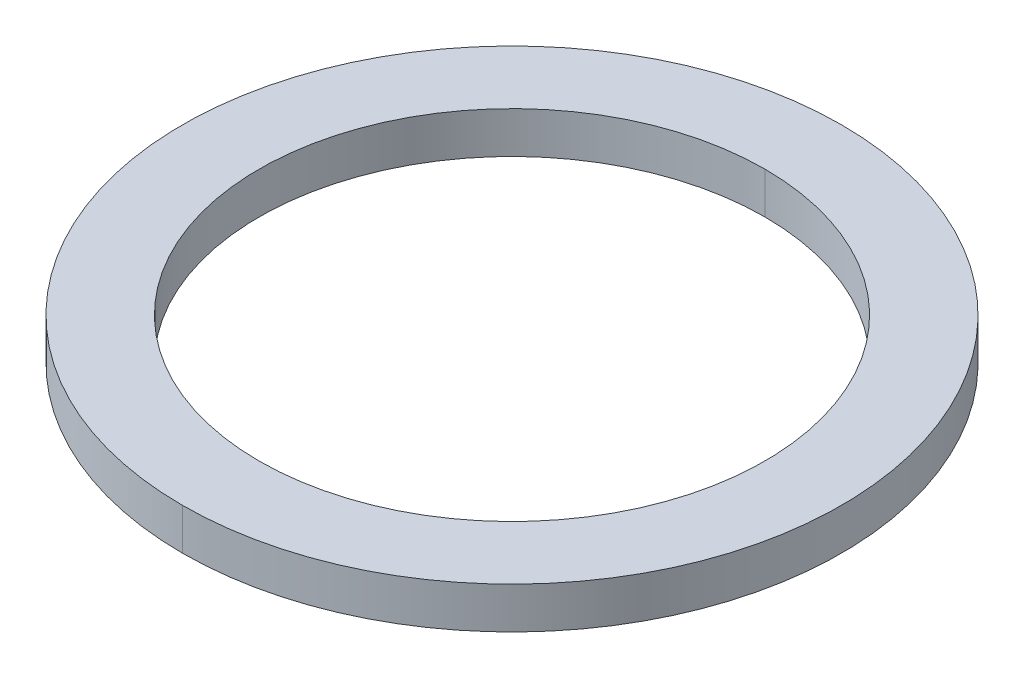
ISO-10303-21;
HEADER;
FILE_DESCRIPTION(('STEP AP214'),'2;1');
FILE_NAME('part.step','',(''),(''),'','','');
FILE_SCHEMA(('AUTOMOTIVE_DESIGN { 1 0 10303 214 1 1 1 1 }'));
ENDSEC;
DATA;
#1=APPLICATION_CONTEXT('core data for automotive mechanical design processes');
#2=APPLICATION_PROTOCOL_DEFINITION('international standard','automotive_design',2000,#1);
#3=PRODUCT_CONTEXT('',#1,'mechanical');
#4=PRODUCT('Part','Part','',(#3));
#5=PRODUCT_RELATED_PRODUCT_CATEGORY('part','',(#4));
#6=PRODUCT_DEFINITION_FORMATION('','',#4);
#7=PRODUCT_DEFINITION_CONTEXT('part definition',#1,'design');
#8=PRODUCT_DEFINITION('design','',#6,#7);
#9=PRODUCT_DEFINITION_SHAPE('','',#8);
#10=(LENGTH_UNIT() NAMED_UNIT(*) SI_UNIT(.MILLI.,.METRE.));
#11=(NAMED_UNIT(*) PLANE_ANGLE_UNIT() SI_UNIT($,.RADIAN.));
#12=(NAMED_UNIT(*) SI_UNIT($,.STERADIAN.) SOLID_ANGLE_UNIT());
#13=UNCERTAINTY_MEASURE_WITH_UNIT(LENGTH_MEASURE(1.E-05),#10,'distance_accuracy_value','');
#14=(GEOMETRIC_REPRESENTATION_CONTEXT(3) GLOBAL_UNCERTAINTY_ASSIGNED_CONTEXT((#13)) GLOBAL_UNIT_ASSIGNED_CONTEXT((#10,
#11,#12)) REPRESENTATION_CONTEXT('',''));
#15=CARTESIAN_POINT('',(0.,0.,0.));
#16=DIRECTION('',(0.,0.,1.));
#17=DIRECTION('',(1.,0.,0.));
#18=AXIS2_PLACEMENT_3D('',#15,#16,#17);
#19=CARTESIAN_POINT('',(-2.90698826646719,6.91171873202198,54.127124258992));
#20=DIRECTION('',(0.,-1.,0.));
#21=DIRECTION('',(0.,0.,1.));
#22=AXIS2_PLACEMENT_3D('',#19,#20,#21);
#23=CYLINDRICAL_SURFACE('',#22,7.95);
#24=DIRECTION('',(0.,-1.,0.));
#25=VECTOR('',#24,1.);
#26=CARTESIAN_POINT('',(-2.90698826646719,6.91171873202198,62.0771242589921));
#27=LINE('',#26,#25);
#28=CARTESIAN_POINT('',(-2.90698826646719,7.91171873202198,62.0771242589921));
#29=VERTEX_POINT('',#28);
#30=CARTESIAN_POINT('',(-2.90698826646719,6.91171873202198,62.0771242589921));
#31=VERTEX_POINT('',#30);
#32=EDGE_CURVE('E74',#29,#31,#27,.T.);
#33=ORIENTED_EDGE('',*,*,#32,.F.);
#34=CARTESIAN_POINT('',(-2.90698826646719,7.91171873202198,54.127124258992));
#35=DIRECTION('',(0.,-1.,0.));
#36=DIRECTION('',(0.,0.,-1.));
#37=AXIS2_PLACEMENT_3D('',#34,#35,#36);
#38=CIRCLE('',#37,7.95);
#39=CARTESIAN_POINT('',(-2.90698826646719,7.91171873202198,46.1771242589921));
#40=VERTEX_POINT('',#39);
#41=EDGE_CURVE('E69',#29,#40,#38,.T.);
#42=ORIENTED_EDGE('',*,*,#41,.T.);
#43=DIRECTION('',(0.,-1.,0.));
#44=VECTOR('',#43,1.);
#45=CARTESIAN_POINT('',(-2.90698826646719,6.91171873202198,46.1771242589921));
#46=LINE('',#45,#44);
#47=CARTESIAN_POINT('',(-2.90698826646719,6.91171873202198,46.1771242589921));
#48=VERTEX_POINT('',#47);
#49=EDGE_CURVE('E71',#40,#48,#46,.T.);
#50=ORIENTED_EDGE('',*,*,#49,.T.);
#51=CARTESIAN_POINT('',(-2.90698826646719,6.91171873202198,54.127124258992));
#52=DIRECTION('',(0.,-1.,0.));
#53=DIRECTION('',(0.,0.,-1.));
#54=AXIS2_PLACEMENT_3D('',#51,#52,#53);
#55=CIRCLE('',#54,7.95);
#56=EDGE_CURVE('E11',#31,#48,#55,.T.);
#57=ORIENTED_EDGE('',*,*,#56,.F.);
#58=EDGE_LOOP('',(#33,#42,#50,#57));
#59=FACE_BOUND('',#58,.T.);
#60=ADVANCED_FACE('F17',(#59),#23,.T.);
#61=CARTESIAN_POINT('',(-9.00698826646719,6.91171873202198,54.127124258992));
#62=DIRECTION('',(0.,1.,0.));
#63=DIRECTION('',(1.,0.,0.));
#64=AXIS2_PLACEMENT_3D('',#61,#62,#63);
#65=PLANE('',#64);
#66=CARTESIAN_POINT('',(-2.90698826646719,6.91171873202198,54.127124258992));
#67=DIRECTION('',(0.,-1.,0.));
#68=DIRECTION('',(0.,0.,-1.));
#69=AXIS2_PLACEMENT_3D('',#66,#67,#68);
#70=CIRCLE('',#69,6.1);
#71=CARTESIAN_POINT('',(-2.90698826646719,6.91171873202198,48.027124258992));
#72=VERTEX_POINT('',#71);
#73=CARTESIAN_POINT('',(-2.90698826646719,6.91171873202198,60.227124258992));
#74=VERTEX_POINT('',#73);
#75=EDGE_CURVE('E26',#72,#74,#70,.T.);
#76=ORIENTED_EDGE('',*,*,#75,.F.);
#77=CARTESIAN_POINT('',(-2.90698826646719,6.91171873202198,54.127124258992));
#78=DIRECTION('',(0.,-1.,0.));
#79=DIRECTION('',(0.,0.,-1.));
#80=AXIS2_PLACEMENT_3D('',#77,#78,#79);
#81=CIRCLE('',#80,6.1);
#82=EDGE_CURVE('E106',#74,#72,#81,.T.);
#83=ORIENTED_EDGE('',*,*,#82,.F.);
#84=EDGE_LOOP('',(#76,#83));
#85=FACE_BOUND('',#84,.T.);
#86=CARTESIAN_POINT('',(-2.90698826646719,6.91171873202198,54.127124258992));
#87=DIRECTION('',(0.,-1.,0.));
#88=DIRECTION('',(0.,0.,-1.));
#89=AXIS2_PLACEMENT_3D('',#86,#87,#88);
#90=CIRCLE('',#89,7.95);
#91=EDGE_CURVE('E84',#48,#31,#90,.T.);
#92=ORIENTED_EDGE('',*,*,#91,.T.);
#93=ORIENTED_EDGE('',*,*,#56,.T.);
#94=EDGE_LOOP('',(#92,#93));
#95=FACE_BOUND('',#94,.T.);
#96=ADVANCED_FACE('F117',(#85,#95),#65,.F.);
#97=CARTESIAN_POINT('',(-2.90698826646719,6.91171873202198,54.127124258992));
#98=DIRECTION('',(0.,-1.,0.));
#99=DIRECTION('',(0.,0.,1.));
#100=AXIS2_PLACEMENT_3D('',#97,#98,#99);
#101=CYLINDRICAL_SURFACE('',#100,6.1);
#102=DIRECTION('',(0.,-1.,0.));
#103=VECTOR('',#102,1.);
#104=CARTESIAN_POINT('',(-2.90698826646719,6.91171873202198,60.227124258992));
#105=LINE('',#104,#103);
#106=CARTESIAN_POINT('',(-2.90698826646719,7.91171873202198,60.227124258992));
#107=VERTEX_POINT('',#106);
#108=EDGE_CURVE('E102',#107,#74,#105,.T.);
#109=ORIENTED_EDGE('',*,*,#108,.F.);
#110=CARTESIAN_POINT('',(-2.90698826646719,7.91171873202198,54.127124258992));
#111=DIRECTION('',(0.,-1.,0.));
#112=DIRECTION('',(0.,0.,-1.));
#113=AXIS2_PLACEMENT_3D('',#110,#111,#112);
#114=CIRCLE('',#113,6.1);
#115=CARTESIAN_POINT('',(-2.90698826646719,7.91171873202198,48.027124258992));
#116=VERTEX_POINT('',#115);
#117=EDGE_CURVE('E20',#116,#107,#114,.T.);
#118=ORIENTED_EDGE('',*,*,#117,.F.);
#119=DIRECTION('',(0.,-1.,0.));
#120=VECTOR('',#119,1.);
#121=CARTESIAN_POINT('',(-2.90698826646719,6.91171873202198,48.027124258992));
#122=LINE('',#121,#120);
#123=EDGE_CURVE('E79',#116,#72,#122,.T.);
#124=ORIENTED_EDGE('',*,*,#123,.T.);
#125=ORIENTED_EDGE('',*,*,#75,.T.);
#126=EDGE_LOOP('',(#109,#118,#124,#125));
#127=FACE_BOUND('',#126,.T.);
#128=ADVANCED_FACE('F113',(#127),#101,.F.);
#129=CARTESIAN_POINT('',(-9.00698826646719,7.91171873202198,54.127124258992));
#130=DIRECTION('',(0.,-1.,0.));
#131=DIRECTION('',(0.,0.,-1.));
#132=AXIS2_PLACEMENT_3D('',#129,#130,#131);
#133=PLANE('',#132);
#134=ORIENTED_EDGE('',*,*,#117,.T.);
#135=CARTESIAN_POINT('',(-2.90698826646719,7.91171873202198,54.127124258992));
#136=DIRECTION('',(0.,-1.,0.));
#137=DIRECTION('',(0.,0.,-1.));
#138=AXIS2_PLACEMENT_3D('',#135,#136,#137);
#139=CIRCLE('',#138,6.1);
#140=EDGE_CURVE('E86',#107,#116,#139,.T.);
#141=ORIENTED_EDGE('',*,*,#140,.T.);
#142=EDGE_LOOP('',(#134,#141));
#143=FACE_BOUND('',#142,.T.);
#144=CARTESIAN_POINT('',(-2.90698826646719,7.91171873202198,54.127124258992));
#145=DIRECTION('',(0.,-1.,0.));
#146=DIRECTION('',(0.,0.,-1.));
#147=AXIS2_PLACEMENT_3D('',#144,#145,#146);
#148=CIRCLE('',#147,7.95);
#149=EDGE_CURVE('E82',#40,#29,#148,.T.);
#150=ORIENTED_EDGE('',*,*,#149,.F.);
#151=ORIENTED_EDGE('',*,*,#41,.F.);
#152=EDGE_LOOP('',(#150,#151));
#153=FACE_BOUND('',#152,.T.);
#154=ADVANCED_FACE('F88',(#143,#153),#133,.F.);
#155=CARTESIAN_POINT('',(-2.90698826646719,6.91171873202198,54.127124258992));
#156=DIRECTION('',(0.,-1.,0.));
#157=DIRECTION('',(0.,0.,1.));
#158=AXIS2_PLACEMENT_3D('',#155,#156,#157);
#159=CYLINDRICAL_SURFACE('',#158,6.1);
#160=ORIENTED_EDGE('',*,*,#140,.F.);
#161=ORIENTED_EDGE('',*,*,#108,.T.);
#162=ORIENTED_EDGE('',*,*,#82,.T.);
#163=ORIENTED_EDGE('',*,*,#123,.F.);
#164=EDGE_LOOP('',(#160,#161,#162,#163));
#165=FACE_BOUND('',#164,.T.);
#166=ADVANCED_FACE('F116',(#165),#159,.F.);
#167=CARTESIAN_POINT('',(-2.90698826646719,6.91171873202198,54.127124258992));
#168=DIRECTION('',(0.,-1.,0.));
#169=DIRECTION('',(0.,0.,1.));
#170=AXIS2_PLACEMENT_3D('',#167,#168,#169);
#171=CYLINDRICAL_SURFACE('',#170,7.95);
#172=ORIENTED_EDGE('',*,*,#149,.T.);
#173=ORIENTED_EDGE('',*,*,#32,.T.);
#174=ORIENTED_EDGE('',*,*,#91,.F.);
#175=ORIENTED_EDGE('',*,*,#49,.F.);
#176=EDGE_LOOP('',(#172,#173,#174,#175));
#177=FACE_BOUND('',#176,.T.);
#178=ADVANCED_FACE('F81',(#177),#171,.T.);
#179=CLOSED_SHELL('',(#60,#96,#128,#154,#166,#178));
#180=MANIFOLD_SOLID_BREP('B1',#179);
#181=ADVANCED_BREP_SHAPE_REPRESENTATION('',(#18,#180),#14);
#182=SHAPE_DEFINITION_REPRESENTATION(#9,#181);
ENDSEC;
END-ISO-10303-21;
